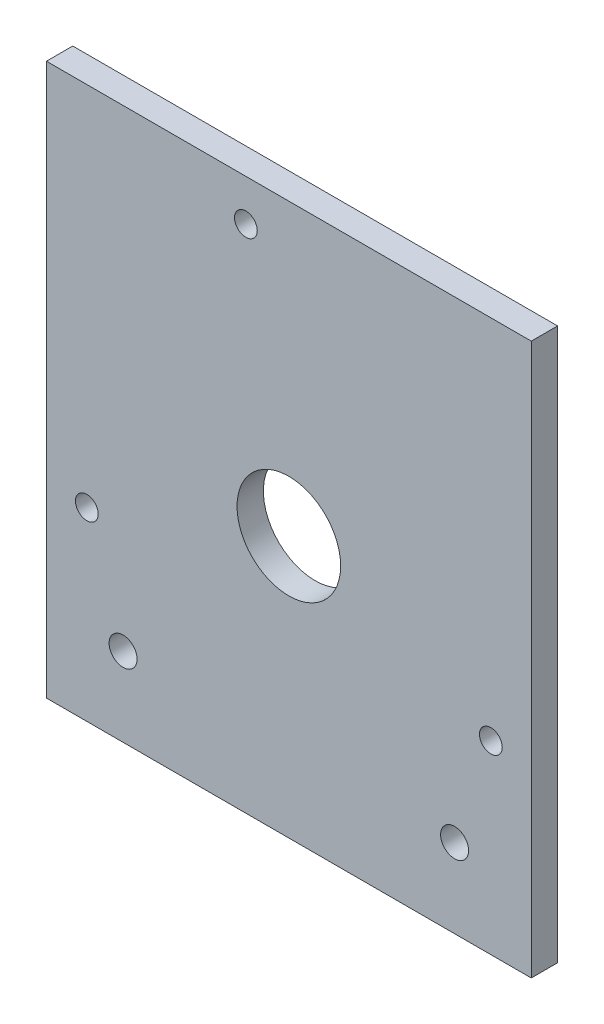
ISO-10303-21;
HEADER;
FILE_DESCRIPTION(('STEP AP214'),'2;1');
FILE_NAME('part.step','',(''),(''),'','','');
FILE_SCHEMA(('AUTOMOTIVE_DESIGN { 1 0 10303 214 1 1 1 1 }'));
ENDSEC;
DATA;
#1=APPLICATION_CONTEXT('core data for automotive mechanical design processes');
#2=APPLICATION_PROTOCOL_DEFINITION('international standard','automotive_design',2000,#1);
#3=PRODUCT_CONTEXT('',#1,'mechanical');
#4=PRODUCT('Part','Part','',(#3));
#5=PRODUCT_RELATED_PRODUCT_CATEGORY('part','',(#4));
#6=PRODUCT_DEFINITION_FORMATION('','',#4);
#7=PRODUCT_DEFINITION_CONTEXT('part definition',#1,'design');
#8=PRODUCT_DEFINITION('design','',#6,#7);
#9=PRODUCT_DEFINITION_SHAPE('','',#8);
#10=(LENGTH_UNIT() NAMED_UNIT(*) SI_UNIT(.MILLI.,.METRE.));
#11=(NAMED_UNIT(*) PLANE_ANGLE_UNIT() SI_UNIT($,.RADIAN.));
#12=(NAMED_UNIT(*) SI_UNIT($,.STERADIAN.) SOLID_ANGLE_UNIT());
#13=UNCERTAINTY_MEASURE_WITH_UNIT(LENGTH_MEASURE(1.E-05),#10,'distance_accuracy_value','');
#14=(GEOMETRIC_REPRESENTATION_CONTEXT(3) GLOBAL_UNCERTAINTY_ASSIGNED_CONTEXT((#13)) GLOBAL_UNIT_ASSIGNED_CONTEXT((#10,
#11,#12)) REPRESENTATION_CONTEXT('',''));
#15=CARTESIAN_POINT('',(0.,0.,0.));
#16=DIRECTION('',(0.,0.,1.));
#17=DIRECTION('',(1.,0.,0.));
#18=AXIS2_PLACEMENT_3D('',#15,#16,#17);
#19=CARTESIAN_POINT('',(0.,0.,6.35));
#20=DIRECTION('',(0.,0.,1.));
#21=DIRECTION('',(1.,0.,0.));
#22=AXIS2_PLACEMENT_3D('',#19,#20,#21);
#23=PLANE('',#22);
#24=CARTESIAN_POINT('',(40.,-44.05,6.35));
#25=DIRECTION('',(0.,0.,1.));
#26=DIRECTION('',(1.,0.,0.));
#27=AXIS2_PLACEMENT_3D('',#24,#25,#26);
#28=CIRCLE('',#27,3.38);
#29=CARTESIAN_POINT('',(43.38,-44.05,6.35));
#30=VERTEX_POINT('',#29);
#31=EDGE_CURVE('E132',#30,#30,#28,.T.);
#32=ORIENTED_EDGE('',*,*,#31,.F.);
#33=EDGE_LOOP('',(#32));
#34=FACE_BOUND('',#33,.T.);
#35=CARTESIAN_POINT('',(-10.3689743589744,60.0103747647142,6.35));
#36=DIRECTION('',(0.,0.,1.));
#37=DIRECTION('',(1.,0.,0.));
#38=AXIS2_PLACEMENT_3D('',#35,#36,#37);
#39=CIRCLE('',#38,2.75);
#40=CARTESIAN_POINT('',(-7.61897435897436,60.0103747647142,6.35));
#41=VERTEX_POINT('',#40);
#42=EDGE_CURVE('E120',#41,#41,#39,.T.);
#43=ORIENTED_EDGE('',*,*,#42,.F.);
#44=EDGE_LOOP('',(#43));
#45=FACE_BOUND('',#44,.T.);
#46=CARTESIAN_POINT('',(-48.75,-18.4,6.35));
#47=DIRECTION('',(0.,0.,1.));
#48=DIRECTION('',(1.,0.,0.));
#49=AXIS2_PLACEMENT_3D('',#46,#47,#48);
#50=CIRCLE('',#49,2.75);
#51=CARTESIAN_POINT('',(-46.,-18.4,6.35));
#52=VERTEX_POINT('',#51);
#53=EDGE_CURVE('E99',#52,#52,#50,.T.);
#54=ORIENTED_EDGE('',*,*,#53,.F.);
#55=EDGE_LOOP('',(#54));
#56=FACE_BOUND('',#55,.T.);
#57=DIRECTION('',(0.,-1.,0.));
#58=VECTOR('',#57,1.);
#59=CARTESIAN_POINT('',(-58.5,70.,6.35));
#60=LINE('',#59,#58);
#61=CARTESIAN_POINT('',(-58.5,70.,6.35));
#62=VERTEX_POINT('',#61);
#63=CARTESIAN_POINT('',(-58.5,-63.1,6.35));
#64=VERTEX_POINT('',#63);
#65=EDGE_CURVE('E84',#62,#64,#60,.T.);
#66=ORIENTED_EDGE('',*,*,#65,.T.);
#67=DIRECTION('',(1.,0.,0.));
#68=VECTOR('',#67,1.);
#69=CARTESIAN_POINT('',(-58.5,-63.1,6.35));
#70=LINE('',#69,#68);
#71=CARTESIAN_POINT('',(58.5,-63.1,6.35));
#72=VERTEX_POINT('',#71);
#73=EDGE_CURVE('E79',#64,#72,#70,.T.);
#74=ORIENTED_EDGE('',*,*,#73,.T.);
#75=DIRECTION('',(0.,1.,0.));
#76=VECTOR('',#75,1.);
#77=CARTESIAN_POINT('',(58.5,70.,6.35));
#78=LINE('',#77,#76);
#79=CARTESIAN_POINT('',(58.5,70.,6.35));
#80=VERTEX_POINT('',#79);
#81=EDGE_CURVE('E82',#72,#80,#78,.T.);
#82=ORIENTED_EDGE('',*,*,#81,.T.);
#83=DIRECTION('',(-1.,0.,0.));
#84=VECTOR('',#83,1.);
#85=CARTESIAN_POINT('',(-58.5,70.,6.35));
#86=LINE('',#85,#84);
#87=EDGE_CURVE('E49',#80,#62,#86,.T.);
#88=ORIENTED_EDGE('',*,*,#87,.T.);
#89=EDGE_LOOP('',(#66,#74,#82,#88));
#90=FACE_BOUND('',#89,.T.);
#91=CARTESIAN_POINT('',(48.75,-18.4,6.35));
#92=DIRECTION('',(0.,0.,1.));
#93=DIRECTION('',(1.,0.,0.));
#94=AXIS2_PLACEMENT_3D('',#91,#92,#93);
#95=CIRCLE('',#94,2.75);
#96=CARTESIAN_POINT('',(51.5,-18.4,6.35));
#97=VERTEX_POINT('',#96);
#98=EDGE_CURVE('E114',#97,#97,#95,.T.);
#99=ORIENTED_EDGE('',*,*,#98,.F.);
#100=EDGE_LOOP('',(#99));
#101=FACE_BOUND('',#100,.T.);
#102=CARTESIAN_POINT('',(-40.,-44.05,6.35));
#103=DIRECTION('',(0.,0.,1.));
#104=DIRECTION('',(1.,0.,0.));
#105=AXIS2_PLACEMENT_3D('',#102,#103,#104);
#106=CIRCLE('',#105,3.38);
#107=CARTESIAN_POINT('',(-36.62,-44.05,6.35));
#108=VERTEX_POINT('',#107);
#109=EDGE_CURVE('E126',#108,#108,#106,.T.);
#110=ORIENTED_EDGE('',*,*,#109,.F.);
#111=EDGE_LOOP('',(#110));
#112=FACE_BOUND('',#111,.T.);
#113=CARTESIAN_POINT('',(0.,0.,6.35));
#114=DIRECTION('',(0.,0.,1.));
#115=DIRECTION('',(1.,0.,0.));
#116=AXIS2_PLACEMENT_3D('',#113,#114,#115);
#117=CIRCLE('',#116,12.5);
#118=CARTESIAN_POINT('',(12.5,0.,6.35));
#119=VERTEX_POINT('',#118);
#120=EDGE_CURVE('E138',#119,#119,#117,.T.);
#121=ORIENTED_EDGE('',*,*,#120,.F.);
#122=EDGE_LOOP('',(#121));
#123=FACE_BOUND('',#122,.T.);
#124=ADVANCED_FACE('F32',(#34,#45,#56,#90,#101,#112,#123),#23,.T.);
#125=CARTESIAN_POINT('',(0.,0.,0.));
#126=DIRECTION('',(0.,0.,1.));
#127=DIRECTION('',(1.,0.,0.));
#128=AXIS2_PLACEMENT_3D('',#125,#126,#127);
#129=PLANE('',#128);
#130=DIRECTION('',(0.,-1.,0.));
#131=VECTOR('',#130,1.);
#132=CARTESIAN_POINT('',(-58.5,70.,0.));
#133=LINE('',#132,#131);
#134=CARTESIAN_POINT('',(-58.5,70.,0.));
#135=VERTEX_POINT('',#134);
#136=CARTESIAN_POINT('',(-58.5,-63.1,0.));
#137=VERTEX_POINT('',#136);
#138=EDGE_CURVE('E96',#135,#137,#133,.T.);
#139=ORIENTED_EDGE('',*,*,#138,.F.);
#140=DIRECTION('',(-1.,0.,0.));
#141=VECTOR('',#140,1.);
#142=CARTESIAN_POINT('',(-58.5,70.,0.));
#143=LINE('',#142,#141);
#144=CARTESIAN_POINT('',(58.5,70.,0.));
#145=VERTEX_POINT('',#144);
#146=EDGE_CURVE('E72',#145,#135,#143,.T.);
#147=ORIENTED_EDGE('',*,*,#146,.F.);
#148=DIRECTION('',(0.,1.,0.));
#149=VECTOR('',#148,1.);
#150=CARTESIAN_POINT('',(58.5,70.,0.));
#151=LINE('',#150,#149);
#152=CARTESIAN_POINT('',(58.5,-63.1,0.));
#153=VERTEX_POINT('',#152);
#154=EDGE_CURVE('E66',#153,#145,#151,.T.);
#155=ORIENTED_EDGE('',*,*,#154,.F.);
#156=DIRECTION('',(1.,0.,0.));
#157=VECTOR('',#156,1.);
#158=CARTESIAN_POINT('',(-58.5,-63.1,0.));
#159=LINE('',#158,#157);
#160=EDGE_CURVE('E88',#137,#153,#159,.T.);
#161=ORIENTED_EDGE('',*,*,#160,.F.);
#162=EDGE_LOOP('',(#139,#147,#155,#161));
#163=FACE_BOUND('',#162,.T.);
#164=CARTESIAN_POINT('',(-48.75,-18.4,0.));
#165=DIRECTION('',(0.,0.,1.));
#166=DIRECTION('',(1.,0.,0.));
#167=AXIS2_PLACEMENT_3D('',#164,#165,#166);
#168=CIRCLE('',#167,2.75);
#169=CARTESIAN_POINT('',(-46.,-18.4,0.));
#170=VERTEX_POINT('',#169);
#171=EDGE_CURVE('E111',#170,#170,#168,.T.);
#172=ORIENTED_EDGE('',*,*,#171,.T.);
#173=EDGE_LOOP('',(#172));
#174=FACE_BOUND('',#173,.T.);
#175=CARTESIAN_POINT('',(48.75,-18.4,0.));
#176=DIRECTION('',(0.,0.,1.));
#177=DIRECTION('',(1.,0.,0.));
#178=AXIS2_PLACEMENT_3D('',#175,#176,#177);
#179=CIRCLE('',#178,2.75);
#180=CARTESIAN_POINT('',(51.5,-18.4,0.));
#181=VERTEX_POINT('',#180);
#182=EDGE_CURVE('E117',#181,#181,#179,.T.);
#183=ORIENTED_EDGE('',*,*,#182,.T.);
#184=EDGE_LOOP('',(#183));
#185=FACE_BOUND('',#184,.T.);
#186=CARTESIAN_POINT('',(-10.3689743589744,60.0103747647142,0.));
#187=DIRECTION('',(0.,0.,1.));
#188=DIRECTION('',(1.,0.,0.));
#189=AXIS2_PLACEMENT_3D('',#186,#187,#188);
#190=CIRCLE('',#189,2.75);
#191=CARTESIAN_POINT('',(-7.61897435897436,60.0103747647142,0.));
#192=VERTEX_POINT('',#191);
#193=EDGE_CURVE('E123',#192,#192,#190,.T.);
#194=ORIENTED_EDGE('',*,*,#193,.T.);
#195=EDGE_LOOP('',(#194));
#196=FACE_BOUND('',#195,.T.);
#197=CARTESIAN_POINT('',(-40.,-44.05,0.));
#198=DIRECTION('',(0.,0.,1.));
#199=DIRECTION('',(1.,0.,0.));
#200=AXIS2_PLACEMENT_3D('',#197,#198,#199);
#201=CIRCLE('',#200,3.38);
#202=CARTESIAN_POINT('',(-36.62,-44.05,0.));
#203=VERTEX_POINT('',#202);
#204=EDGE_CURVE('E129',#203,#203,#201,.T.);
#205=ORIENTED_EDGE('',*,*,#204,.T.);
#206=EDGE_LOOP('',(#205));
#207=FACE_BOUND('',#206,.T.);
#208=CARTESIAN_POINT('',(40.,-44.05,0.));
#209=DIRECTION('',(0.,0.,1.));
#210=DIRECTION('',(1.,0.,0.));
#211=AXIS2_PLACEMENT_3D('',#208,#209,#210);
#212=CIRCLE('',#211,3.38);
#213=CARTESIAN_POINT('',(43.38,-44.05,0.));
#214=VERTEX_POINT('',#213);
#215=EDGE_CURVE('E135',#214,#214,#212,.T.);
#216=ORIENTED_EDGE('',*,*,#215,.T.);
#217=EDGE_LOOP('',(#216));
#218=FACE_BOUND('',#217,.T.);
#219=CARTESIAN_POINT('',(0.,0.,0.));
#220=DIRECTION('',(0.,0.,1.));
#221=DIRECTION('',(1.,0.,0.));
#222=AXIS2_PLACEMENT_3D('',#219,#220,#221);
#223=CIRCLE('',#222,12.5);
#224=CARTESIAN_POINT('',(12.5,0.,0.));
#225=VERTEX_POINT('',#224);
#226=EDGE_CURVE('E141',#225,#225,#223,.T.);
#227=ORIENTED_EDGE('',*,*,#226,.T.);
#228=EDGE_LOOP('',(#227));
#229=FACE_BOUND('',#228,.T.);
#230=ADVANCED_FACE('F107',(#163,#174,#185,#196,#207,#218,#229),#129,.F.);
#231=CARTESIAN_POINT('',(-58.5,70.,6.35));
#232=DIRECTION('',(1.,0.,0.));
#233=DIRECTION('',(0.,1.,0.));
#234=AXIS2_PLACEMENT_3D('',#231,#232,#233);
#235=PLANE('',#234);
#236=ORIENTED_EDGE('',*,*,#138,.T.);
#237=DIRECTION('',(0.,0.,-1.));
#238=VECTOR('',#237,1.);
#239=CARTESIAN_POINT('',(-58.5,-63.1,6.35));
#240=LINE('',#239,#238);
#241=EDGE_CURVE('E11',#64,#137,#240,.T.);
#242=ORIENTED_EDGE('',*,*,#241,.F.);
#243=ORIENTED_EDGE('',*,*,#65,.F.);
#244=DIRECTION('',(0.,0.,-1.));
#245=VECTOR('',#244,1.);
#246=CARTESIAN_POINT('',(-58.5,70.,6.35));
#247=LINE('',#246,#245);
#248=EDGE_CURVE('E92',#62,#135,#247,.T.);
#249=ORIENTED_EDGE('',*,*,#248,.T.);
#250=EDGE_LOOP('',(#236,#242,#243,#249));
#251=FACE_BOUND('',#250,.T.);
#252=ADVANCED_FACE('F34',(#251),#235,.F.);
#253=CARTESIAN_POINT('',(-58.5,-63.1,6.35));
#254=DIRECTION('',(0.,1.,0.));
#255=DIRECTION('',(-1.,0.,0.));
#256=AXIS2_PLACEMENT_3D('',#253,#254,#255);
#257=PLANE('',#256);
#258=ORIENTED_EDGE('',*,*,#160,.T.);
#259=DIRECTION('',(0.,0.,-1.));
#260=VECTOR('',#259,1.);
#261=CARTESIAN_POINT('',(58.5,-63.1,6.35));
#262=LINE('',#261,#260);
#263=EDGE_CURVE('E41',#72,#153,#262,.T.);
#264=ORIENTED_EDGE('',*,*,#263,.F.);
#265=ORIENTED_EDGE('',*,*,#73,.F.);
#266=ORIENTED_EDGE('',*,*,#241,.T.);
#267=EDGE_LOOP('',(#258,#264,#265,#266));
#268=FACE_BOUND('',#267,.T.);
#269=ADVANCED_FACE('F87',(#268),#257,.F.);
#270=CARTESIAN_POINT('',(58.5,70.,6.35));
#271=DIRECTION('',(-1.,0.,0.));
#272=DIRECTION('',(0.,-1.,0.));
#273=AXIS2_PLACEMENT_3D('',#270,#271,#272);
#274=PLANE('',#273);
#275=ORIENTED_EDGE('',*,*,#154,.T.);
#276=DIRECTION('',(0.,0.,-1.));
#277=VECTOR('',#276,1.);
#278=CARTESIAN_POINT('',(58.5,70.,6.35));
#279=LINE('',#278,#277);
#280=EDGE_CURVE('E89',#80,#145,#279,.T.);
#281=ORIENTED_EDGE('',*,*,#280,.F.);
#282=ORIENTED_EDGE('',*,*,#81,.F.);
#283=ORIENTED_EDGE('',*,*,#263,.T.);
#284=EDGE_LOOP('',(#275,#281,#282,#283));
#285=FACE_BOUND('',#284,.T.);
#286=ADVANCED_FACE('F90',(#285),#274,.F.);
#287=CARTESIAN_POINT('',(-58.5,70.,6.35));
#288=DIRECTION('',(0.,-1.,0.));
#289=DIRECTION('',(1.,0.,0.));
#290=AXIS2_PLACEMENT_3D('',#287,#288,#289);
#291=PLANE('',#290);
#292=ORIENTED_EDGE('',*,*,#146,.T.);
#293=ORIENTED_EDGE('',*,*,#248,.F.);
#294=ORIENTED_EDGE('',*,*,#87,.F.);
#295=ORIENTED_EDGE('',*,*,#280,.T.);
#296=EDGE_LOOP('',(#292,#293,#294,#295));
#297=FACE_BOUND('',#296,.T.);
#298=ADVANCED_FACE('F104',(#297),#291,.F.);
#299=CARTESIAN_POINT('',(-48.75,-18.4,6.35));
#300=DIRECTION('',(0.,0.,-1.));
#301=DIRECTION('',(-1.,0.,0.));
#302=AXIS2_PLACEMENT_3D('',#299,#300,#301);
#303=CYLINDRICAL_SURFACE('',#302,2.75);
#304=ORIENTED_EDGE('',*,*,#53,.T.);
#305=EDGE_LOOP('',(#304));
#306=FACE_BOUND('',#305,.T.);
#307=ORIENTED_EDGE('',*,*,#171,.F.);
#308=EDGE_LOOP('',(#307));
#309=FACE_BOUND('',#308,.T.);
#310=ADVANCED_FACE('F160',(#306,#309),#303,.F.);
#311=CARTESIAN_POINT('',(48.75,-18.4,6.35));
#312=DIRECTION('',(0.,0.,-1.));
#313=DIRECTION('',(-1.,0.,0.));
#314=AXIS2_PLACEMENT_3D('',#311,#312,#313);
#315=CYLINDRICAL_SURFACE('',#314,2.75);
#316=ORIENTED_EDGE('',*,*,#98,.T.);
#317=EDGE_LOOP('',(#316));
#318=FACE_BOUND('',#317,.T.);
#319=ORIENTED_EDGE('',*,*,#182,.F.);
#320=EDGE_LOOP('',(#319));
#321=FACE_BOUND('',#320,.T.);
#322=ADVANCED_FACE('F206',(#318,#321),#315,.F.);
#323=CARTESIAN_POINT('',(-10.3689743589744,60.0103747647142,6.35));
#324=DIRECTION('',(0.,0.,-1.));
#325=DIRECTION('',(-1.,0.,0.));
#326=AXIS2_PLACEMENT_3D('',#323,#324,#325);
#327=CYLINDRICAL_SURFACE('',#326,2.75);
#328=ORIENTED_EDGE('',*,*,#42,.T.);
#329=EDGE_LOOP('',(#328));
#330=FACE_BOUND('',#329,.T.);
#331=ORIENTED_EDGE('',*,*,#193,.F.);
#332=EDGE_LOOP('',(#331));
#333=FACE_BOUND('',#332,.T.);
#334=ADVANCED_FACE('F214',(#330,#333),#327,.F.);
#335=CARTESIAN_POINT('',(-40.,-44.05,6.35));
#336=DIRECTION('',(0.,0.,-1.));
#337=DIRECTION('',(-1.,0.,0.));
#338=AXIS2_PLACEMENT_3D('',#335,#336,#337);
#339=CYLINDRICAL_SURFACE('',#338,3.38);
#340=ORIENTED_EDGE('',*,*,#109,.T.);
#341=EDGE_LOOP('',(#340));
#342=FACE_BOUND('',#341,.T.);
#343=ORIENTED_EDGE('',*,*,#204,.F.);
#344=EDGE_LOOP('',(#343));
#345=FACE_BOUND('',#344,.T.);
#346=ADVANCED_FACE('F222',(#342,#345),#339,.F.);
#347=CARTESIAN_POINT('',(40.,-44.05,6.35));
#348=DIRECTION('',(0.,0.,-1.));
#349=DIRECTION('',(-1.,0.,0.));
#350=AXIS2_PLACEMENT_3D('',#347,#348,#349);
#351=CYLINDRICAL_SURFACE('',#350,3.38);
#352=ORIENTED_EDGE('',*,*,#31,.T.);
#353=EDGE_LOOP('',(#352));
#354=FACE_BOUND('',#353,.T.);
#355=ORIENTED_EDGE('',*,*,#215,.F.);
#356=EDGE_LOOP('',(#355));
#357=FACE_BOUND('',#356,.T.);
#358=ADVANCED_FACE('F231',(#354,#357),#351,.F.);
#359=CARTESIAN_POINT('',(0.,0.,6.35));
#360=DIRECTION('',(0.,0.,-1.));
#361=DIRECTION('',(-1.,0.,0.));
#362=AXIS2_PLACEMENT_3D('',#359,#360,#361);
#363=CYLINDRICAL_SURFACE('',#362,12.5);
#364=ORIENTED_EDGE('',*,*,#120,.T.);
#365=EDGE_LOOP('',(#364));
#366=FACE_BOUND('',#365,.T.);
#367=ORIENTED_EDGE('',*,*,#226,.F.);
#368=EDGE_LOOP('',(#367));
#369=FACE_BOUND('',#368,.T.);
#370=ADVANCED_FACE('F147',(#366,#369),#363,.F.);
#371=CLOSED_SHELL('',(#124,#230,#252,#269,#286,#298,#310,#322,#334,#346,#358,#370));
#372=MANIFOLD_SOLID_BREP('B2',#371);
#373=ADVANCED_BREP_SHAPE_REPRESENTATION('',(#18,#372),#14);
#374=SHAPE_DEFINITION_REPRESENTATION(#9,#373);
ENDSEC;
END-ISO-10303-21;
